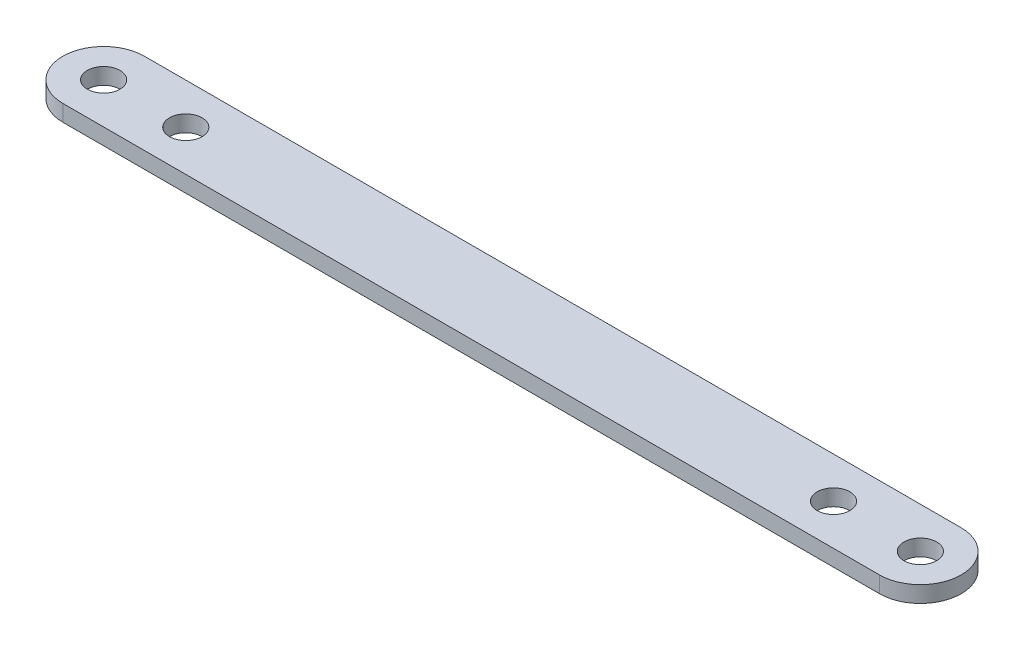
ISO-10303-21;
HEADER;
FILE_DESCRIPTION(('STEP AP214'),'2;1');
FILE_NAME('part.step','',(''),(''),'','','');
FILE_SCHEMA(('AUTOMOTIVE_DESIGN { 1 0 10303 214 1 1 1 1 }'));
ENDSEC;
DATA;
#1=APPLICATION_CONTEXT('core data for automotive mechanical design processes');
#2=APPLICATION_PROTOCOL_DEFINITION('international standard','automotive_design',2000,#1);
#3=PRODUCT_CONTEXT('',#1,'mechanical');
#4=PRODUCT('Part','Part','',(#3));
#5=PRODUCT_RELATED_PRODUCT_CATEGORY('part','',(#4));
#6=PRODUCT_DEFINITION_FORMATION('','',#4);
#7=PRODUCT_DEFINITION_CONTEXT('part definition',#1,'design');
#8=PRODUCT_DEFINITION('design','',#6,#7);
#9=PRODUCT_DEFINITION_SHAPE('','',#8);
#10=(LENGTH_UNIT() NAMED_UNIT(*) SI_UNIT(.MILLI.,.METRE.));
#11=(NAMED_UNIT(*) PLANE_ANGLE_UNIT() SI_UNIT($,.RADIAN.));
#12=(NAMED_UNIT(*) SI_UNIT($,.STERADIAN.) SOLID_ANGLE_UNIT());
#13=UNCERTAINTY_MEASURE_WITH_UNIT(LENGTH_MEASURE(1.E-05),#10,'distance_accuracy_value','');
#14=(GEOMETRIC_REPRESENTATION_CONTEXT(3) GLOBAL_UNCERTAINTY_ASSIGNED_CONTEXT((#13)) GLOBAL_UNIT_ASSIGNED_CONTEXT((#10,
#11,#12)) REPRESENTATION_CONTEXT('',''));
#15=CARTESIAN_POINT('',(0.,0.,0.));
#16=DIRECTION('',(0.,0.,1.));
#17=DIRECTION('',(1.,0.,0.));
#18=AXIS2_PLACEMENT_3D('',#15,#16,#17);
#19=CARTESIAN_POINT('',(0.,2.,0.));
#20=DIRECTION('',(0.,1.,0.));
#21=DIRECTION('',(0.,0.,1.));
#22=AXIS2_PLACEMENT_3D('',#19,#20,#21);
#23=PLANE('',#22);
#24=CARTESIAN_POINT('',(10.057445080854,2.,0.));
#25=DIRECTION('',(0.,1.,0.));
#26=DIRECTION('',(0.,0.,1.));
#27=AXIS2_PLACEMENT_3D('',#24,#25,#26);
#28=CIRCLE('',#27,2.);
#29=CARTESIAN_POINT('',(10.057445080854,2.,2.));
#30=VERTEX_POINT('',#29);
#31=EDGE_CURVE('E185',#30,#30,#28,.T.);
#32=ORIENTED_EDGE('',*,*,#31,.F.);
#33=EDGE_LOOP('',(#32));
#34=FACE_BOUND('',#33,.T.);
#35=CARTESIAN_POINT('',(89.3664301639845,2.,0.));
#36=DIRECTION('',(0.,1.,0.));
#37=DIRECTION('',(0.,0.,1.));
#38=AXIS2_PLACEMENT_3D('',#35,#36,#37);
#39=CIRCLE('',#38,2.);
#40=CARTESIAN_POINT('',(89.3664301639845,2.,1.99999999999998));
#41=VERTEX_POINT('',#40);
#42=EDGE_CURVE('E181',#41,#41,#39,.T.);
#43=ORIENTED_EDGE('',*,*,#42,.F.);
#44=EDGE_LOOP('',(#43));
#45=FACE_BOUND('',#44,.T.);
#46=CARTESIAN_POINT('',(0.,2.,0.));
#47=DIRECTION('',(0.,1.,0.));
#48=DIRECTION('',(0.,0.,1.));
#49=AXIS2_PLACEMENT_3D('',#46,#47,#48);
#50=CIRCLE('',#49,5.);
#51=CARTESIAN_POINT('',(0.,2.,-5.));
#52=VERTEX_POINT('',#51);
#53=CARTESIAN_POINT('',(0.,2.,5.));
#54=VERTEX_POINT('',#53);
#55=EDGE_CURVE('E124',#52,#54,#50,.T.);
#56=ORIENTED_EDGE('',*,*,#55,.T.);
#57=DIRECTION('',(1.,0.,0.));
#58=VECTOR('',#57,1.);
#59=CARTESIAN_POINT('',(0.,2.,5.));
#60=LINE('',#59,#58);
#61=CARTESIAN_POINT('',(100.,2.,4.99999999999998));
#62=VERTEX_POINT('',#61);
#63=EDGE_CURVE('E117',#54,#62,#60,.T.);
#64=ORIENTED_EDGE('',*,*,#63,.T.);
#65=CARTESIAN_POINT('',(100.,2.,0.));
#66=DIRECTION('',(0.,1.,0.));
#67=DIRECTION('',(0.,0.,1.));
#68=AXIS2_PLACEMENT_3D('',#65,#66,#67);
#69=CIRCLE('',#68,5.);
#70=CARTESIAN_POINT('',(100.,2.,-5.));
#71=VERTEX_POINT('',#70);
#72=EDGE_CURVE('E123',#62,#71,#69,.T.);
#73=ORIENTED_EDGE('',*,*,#72,.T.);
#74=DIRECTION('',(1.,0.,0.));
#75=VECTOR('',#74,1.);
#76=CARTESIAN_POINT('',(0.,2.,-5.));
#77=LINE('',#76,#75);
#78=EDGE_CURVE('E136',#52,#71,#77,.T.);
#79=ORIENTED_EDGE('',*,*,#78,.F.);
#80=EDGE_LOOP('',(#56,#64,#73,#79));
#81=FACE_BOUND('',#80,.T.);
#82=CARTESIAN_POINT('',(0.,2.,0.));
#83=DIRECTION('',(0.,1.,0.));
#84=DIRECTION('',(0.,0.,1.));
#85=AXIS2_PLACEMENT_3D('',#82,#83,#84);
#86=CIRCLE('',#85,2.);
#87=CARTESIAN_POINT('',(0.,2.,2.));
#88=VERTEX_POINT('',#87);
#89=EDGE_CURVE('E161',#88,#88,#86,.T.);
#90=ORIENTED_EDGE('',*,*,#89,.F.);
#91=EDGE_LOOP('',(#90));
#92=FACE_BOUND('',#91,.T.);
#93=CARTESIAN_POINT('',(100.,2.,0.));
#94=DIRECTION('',(0.,1.,0.));
#95=DIRECTION('',(0.,0.,1.));
#96=AXIS2_PLACEMENT_3D('',#93,#94,#95);
#97=CIRCLE('',#96,2.);
#98=CARTESIAN_POINT('',(100.,2.,1.99999999999998));
#99=VERTEX_POINT('',#98);
#100=EDGE_CURVE('E169',#99,#99,#97,.T.);
#101=ORIENTED_EDGE('',*,*,#100,.F.);
#102=EDGE_LOOP('',(#101));
#103=FACE_BOUND('',#102,.T.);
#104=ADVANCED_FACE('F73',(#34,#45,#81,#92,#103),#23,.T.);
#105=CARTESIAN_POINT('',(0.,0.,0.));
#106=DIRECTION('',(0.,1.,0.));
#107=DIRECTION('',(0.,0.,1.));
#108=AXIS2_PLACEMENT_3D('',#105,#106,#107);
#109=PLANE('',#108);
#110=CARTESIAN_POINT('',(10.057445080854,0.,0.));
#111=DIRECTION('',(0.,1.,0.));
#112=DIRECTION('',(0.,0.,1.));
#113=AXIS2_PLACEMENT_3D('',#110,#111,#112);
#114=CIRCLE('',#113,2.);
#115=CARTESIAN_POINT('',(10.057445080854,0.,2.));
#116=VERTEX_POINT('',#115);
#117=EDGE_CURVE('E173',#116,#116,#114,.T.);
#118=ORIENTED_EDGE('',*,*,#117,.T.);
#119=EDGE_LOOP('',(#118));
#120=FACE_BOUND('',#119,.T.);
#121=CARTESIAN_POINT('',(89.3664301639845,0.,0.));
#122=DIRECTION('',(0.,1.,0.));
#123=DIRECTION('',(0.,0.,1.));
#124=AXIS2_PLACEMENT_3D('',#121,#122,#123);
#125=CIRCLE('',#124,2.);
#126=CARTESIAN_POINT('',(89.3664301639845,0.,1.99999999999998));
#127=VERTEX_POINT('',#126);
#128=EDGE_CURVE('E177',#127,#127,#125,.T.);
#129=ORIENTED_EDGE('',*,*,#128,.T.);
#130=EDGE_LOOP('',(#129));
#131=FACE_BOUND('',#130,.T.);
#132=CARTESIAN_POINT('',(0.,0.,0.));
#133=DIRECTION('',(0.,1.,0.));
#134=DIRECTION('',(0.,0.,1.));
#135=AXIS2_PLACEMENT_3D('',#132,#133,#134);
#136=CIRCLE('',#135,5.);
#137=CARTESIAN_POINT('',(0.,0.,-5.));
#138=VERTEX_POINT('',#137);
#139=CARTESIAN_POINT('',(0.,0.,5.));
#140=VERTEX_POINT('',#139);
#141=EDGE_CURVE('E142',#138,#140,#136,.T.);
#142=ORIENTED_EDGE('',*,*,#141,.F.);
#143=DIRECTION('',(1.,0.,0.));
#144=VECTOR('',#143,1.);
#145=CARTESIAN_POINT('',(0.,0.,-5.));
#146=LINE('',#145,#144);
#147=CARTESIAN_POINT('',(100.,0.,-5.));
#148=VERTEX_POINT('',#147);
#149=EDGE_CURVE('E151',#138,#148,#146,.T.);
#150=ORIENTED_EDGE('',*,*,#149,.T.);
#151=CARTESIAN_POINT('',(100.,0.,0.));
#152=DIRECTION('',(0.,1.,0.));
#153=DIRECTION('',(0.,0.,1.));
#154=AXIS2_PLACEMENT_3D('',#151,#152,#153);
#155=CIRCLE('',#154,5.);
#156=CARTESIAN_POINT('',(100.,0.,4.99999999999998));
#157=VERTEX_POINT('',#156);
#158=EDGE_CURVE('E148',#157,#148,#155,.T.);
#159=ORIENTED_EDGE('',*,*,#158,.F.);
#160=DIRECTION('',(1.,0.,0.));
#161=VECTOR('',#160,1.);
#162=CARTESIAN_POINT('',(0.,0.,5.));
#163=LINE('',#162,#161);
#164=EDGE_CURVE('E130',#140,#157,#163,.T.);
#165=ORIENTED_EDGE('',*,*,#164,.F.);
#166=EDGE_LOOP('',(#142,#150,#159,#165));
#167=FACE_BOUND('',#166,.T.);
#168=CARTESIAN_POINT('',(0.,0.,0.));
#169=DIRECTION('',(0.,1.,0.));
#170=DIRECTION('',(0.,0.,1.));
#171=AXIS2_PLACEMENT_3D('',#168,#169,#170);
#172=CIRCLE('',#171,2.);
#173=CARTESIAN_POINT('',(0.,0.,2.));
#174=VERTEX_POINT('',#173);
#175=EDGE_CURVE('E145',#174,#174,#172,.T.);
#176=ORIENTED_EDGE('',*,*,#175,.T.);
#177=EDGE_LOOP('',(#176));
#178=FACE_BOUND('',#177,.T.);
#179=CARTESIAN_POINT('',(100.,0.,0.));
#180=DIRECTION('',(0.,1.,0.));
#181=DIRECTION('',(0.,0.,1.));
#182=AXIS2_PLACEMENT_3D('',#179,#180,#181);
#183=CIRCLE('',#182,2.);
#184=CARTESIAN_POINT('',(100.,0.,1.99999999999998));
#185=VERTEX_POINT('',#184);
#186=EDGE_CURVE('E165',#185,#185,#183,.T.);
#187=ORIENTED_EDGE('',*,*,#186,.T.);
#188=EDGE_LOOP('',(#187));
#189=FACE_BOUND('',#188,.T.);
#190=ADVANCED_FACE('F193',(#120,#131,#167,#178,#189),#109,.F.);
#191=CARTESIAN_POINT('',(0.,2.,0.));
#192=DIRECTION('',(0.,-1.,0.));
#193=DIRECTION('',(0.,0.,-1.));
#194=AXIS2_PLACEMENT_3D('',#191,#192,#193);
#195=CYLINDRICAL_SURFACE('',#194,5.);
#196=ORIENTED_EDGE('',*,*,#141,.T.);
#197=DIRECTION('',(0.,-1.,0.));
#198=VECTOR('',#197,1.);
#199=CARTESIAN_POINT('',(0.,2.,5.));
#200=LINE('',#199,#198);
#201=EDGE_CURVE('E12',#54,#140,#200,.T.);
#202=ORIENTED_EDGE('',*,*,#201,.F.);
#203=ORIENTED_EDGE('',*,*,#55,.F.);
#204=DIRECTION('',(0.,-1.,0.));
#205=VECTOR('',#204,1.);
#206=CARTESIAN_POINT('',(0.,2.,-5.));
#207=LINE('',#206,#205);
#208=EDGE_CURVE('E91',#52,#138,#207,.T.);
#209=ORIENTED_EDGE('',*,*,#208,.T.);
#210=EDGE_LOOP('',(#196,#202,#203,#209));
#211=FACE_BOUND('',#210,.T.);
#212=ADVANCED_FACE('F75',(#211),#195,.T.);
#213=CARTESIAN_POINT('',(0.,2.,5.));
#214=DIRECTION('',(0.,0.,-1.));
#215=DIRECTION('',(-1.,0.,0.));
#216=AXIS2_PLACEMENT_3D('',#213,#214,#215);
#217=PLANE('',#216);
#218=ORIENTED_EDGE('',*,*,#164,.T.);
#219=DIRECTION('',(0.,-1.,0.));
#220=VECTOR('',#219,1.);
#221=CARTESIAN_POINT('',(100.,2.,4.99999999999998));
#222=LINE('',#221,#220);
#223=EDGE_CURVE('E83',#62,#157,#222,.T.);
#224=ORIENTED_EDGE('',*,*,#223,.F.);
#225=ORIENTED_EDGE('',*,*,#63,.F.);
#226=ORIENTED_EDGE('',*,*,#201,.T.);
#227=EDGE_LOOP('',(#218,#224,#225,#226));
#228=FACE_BOUND('',#227,.T.);
#229=ADVANCED_FACE('F129',(#228),#217,.F.);
#230=CARTESIAN_POINT('',(100.,2.,0.));
#231=DIRECTION('',(0.,-1.,0.));
#232=DIRECTION('',(0.,0.,-1.));
#233=AXIS2_PLACEMENT_3D('',#230,#231,#232);
#234=CYLINDRICAL_SURFACE('',#233,5.);
#235=ORIENTED_EDGE('',*,*,#158,.T.);
#236=DIRECTION('',(0.,-1.,0.));
#237=VECTOR('',#236,1.);
#238=CARTESIAN_POINT('',(100.,2.,-5.));
#239=LINE('',#238,#237);
#240=EDGE_CURVE('E106',#71,#148,#239,.T.);
#241=ORIENTED_EDGE('',*,*,#240,.F.);
#242=ORIENTED_EDGE('',*,*,#72,.F.);
#243=ORIENTED_EDGE('',*,*,#223,.T.);
#244=EDGE_LOOP('',(#235,#241,#242,#243));
#245=FACE_BOUND('',#244,.T.);
#246=ADVANCED_FACE('F134',(#245),#234,.T.);
#247=CARTESIAN_POINT('',(0.,2.,-5.));
#248=DIRECTION('',(0.,0.,-1.));
#249=DIRECTION('',(-1.,0.,0.));
#250=AXIS2_PLACEMENT_3D('',#247,#248,#249);
#251=PLANE('',#250);
#252=ORIENTED_EDGE('',*,*,#149,.F.);
#253=ORIENTED_EDGE('',*,*,#208,.F.);
#254=ORIENTED_EDGE('',*,*,#78,.T.);
#255=ORIENTED_EDGE('',*,*,#240,.T.);
#256=EDGE_LOOP('',(#252,#253,#254,#255));
#257=FACE_BOUND('',#256,.T.);
#258=ADVANCED_FACE('F221',(#257),#251,.T.);
#259=CARTESIAN_POINT('',(0.,0.,0.));
#260=DIRECTION('',(0.,1.,0.));
#261=DIRECTION('',(0.,0.,1.));
#262=AXIS2_PLACEMENT_3D('',#259,#260,#261);
#263=CYLINDRICAL_SURFACE('',#262,2.);
#264=ORIENTED_EDGE('',*,*,#175,.F.);
#265=EDGE_LOOP('',(#264));
#266=FACE_BOUND('',#265,.T.);
#267=ORIENTED_EDGE('',*,*,#89,.T.);
#268=EDGE_LOOP('',(#267));
#269=FACE_BOUND('',#268,.T.);
#270=ADVANCED_FACE('F215',(#266,#269),#263,.F.);
#271=CARTESIAN_POINT('',(100.,0.,0.));
#272=DIRECTION('',(0.,1.,0.));
#273=DIRECTION('',(0.,0.,1.));
#274=AXIS2_PLACEMENT_3D('',#271,#272,#273);
#275=CYLINDRICAL_SURFACE('',#274,2.);
#276=ORIENTED_EDGE('',*,*,#186,.F.);
#277=EDGE_LOOP('',(#276));
#278=FACE_BOUND('',#277,.T.);
#279=ORIENTED_EDGE('',*,*,#100,.T.);
#280=EDGE_LOOP('',(#279));
#281=FACE_BOUND('',#280,.T.);
#282=ADVANCED_FACE('F209',(#278,#281),#275,.F.);
#283=CARTESIAN_POINT('',(89.3664301639845,0.,0.));
#284=DIRECTION('',(0.,1.,0.));
#285=DIRECTION('',(0.,0.,1.));
#286=AXIS2_PLACEMENT_3D('',#283,#284,#285);
#287=CYLINDRICAL_SURFACE('',#286,2.);
#288=ORIENTED_EDGE('',*,*,#128,.F.);
#289=EDGE_LOOP('',(#288));
#290=FACE_BOUND('',#289,.T.);
#291=ORIENTED_EDGE('',*,*,#42,.T.);
#292=EDGE_LOOP('',(#291));
#293=FACE_BOUND('',#292,.T.);
#294=ADVANCED_FACE('F199',(#290,#293),#287,.F.);
#295=CARTESIAN_POINT('',(10.057445080854,0.,0.));
#296=DIRECTION('',(0.,1.,0.));
#297=DIRECTION('',(0.,0.,1.));
#298=AXIS2_PLACEMENT_3D('',#295,#296,#297);
#299=CYLINDRICAL_SURFACE('',#298,2.);
#300=ORIENTED_EDGE('',*,*,#117,.F.);
#301=EDGE_LOOP('',(#300));
#302=FACE_BOUND('',#301,.T.);
#303=ORIENTED_EDGE('',*,*,#31,.T.);
#304=EDGE_LOOP('',(#303));
#305=FACE_BOUND('',#304,.T.);
#306=ADVANCED_FACE('F196',(#302,#305),#299,.F.);
#307=CLOSED_SHELL('',(#104,#190,#212,#229,#246,#258,#270,#282,#294,#306));
#308=MANIFOLD_SOLID_BREP('B2',#307);
#309=ADVANCED_BREP_SHAPE_REPRESENTATION('',(#18,#308),#14);
#310=SHAPE_DEFINITION_REPRESENTATION(#9,#309);
ENDSEC;
END-ISO-10303-21;
